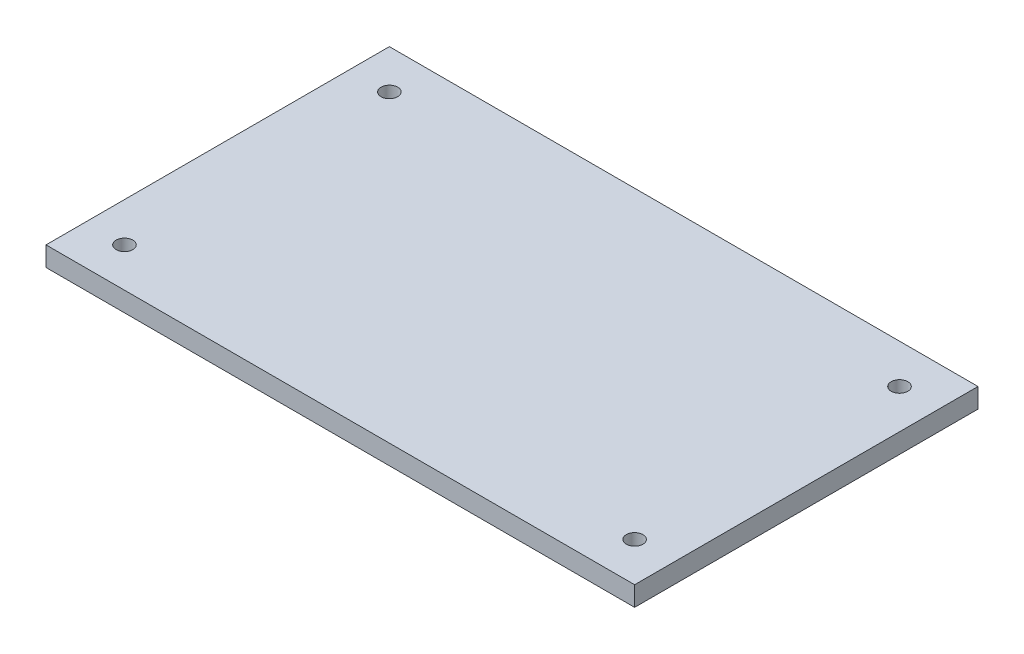
ISO-10303-21;
HEADER;
FILE_DESCRIPTION(('STEP AP214'),'2;1');
FILE_NAME('part.step','',(''),(''),'','','');
FILE_SCHEMA(('AUTOMOTIVE_DESIGN { 1 0 10303 214 1 1 1 1 }'));
ENDSEC;
DATA;
#1=APPLICATION_CONTEXT('core data for automotive mechanical design processes');
#2=APPLICATION_PROTOCOL_DEFINITION('international standard','automotive_design',2000,#1);
#3=PRODUCT_CONTEXT('',#1,'mechanical');
#4=PRODUCT('Part','Part','',(#3));
#5=PRODUCT_RELATED_PRODUCT_CATEGORY('part','',(#4));
#6=PRODUCT_DEFINITION_FORMATION('','',#4);
#7=PRODUCT_DEFINITION_CONTEXT('part definition',#1,'design');
#8=PRODUCT_DEFINITION('design','',#6,#7);
#9=PRODUCT_DEFINITION_SHAPE('','',#8);
#10=(LENGTH_UNIT() NAMED_UNIT(*) SI_UNIT(.MILLI.,.METRE.));
#11=(NAMED_UNIT(*) PLANE_ANGLE_UNIT() SI_UNIT($,.RADIAN.));
#12=(NAMED_UNIT(*) SI_UNIT($,.STERADIAN.) SOLID_ANGLE_UNIT());
#13=UNCERTAINTY_MEASURE_WITH_UNIT(LENGTH_MEASURE(1.E-05),#10,'distance_accuracy_value','');
#14=(GEOMETRIC_REPRESENTATION_CONTEXT(3) GLOBAL_UNCERTAINTY_ASSIGNED_CONTEXT((#13)) GLOBAL_UNIT_ASSIGNED_CONTEXT((#10,
#11,#12)) REPRESENTATION_CONTEXT('',''));
#15=CARTESIAN_POINT('',(0.,0.,0.));
#16=DIRECTION('',(0.,0.,1.));
#17=DIRECTION('',(1.,0.,0.));
#18=AXIS2_PLACEMENT_3D('',#15,#16,#17);
#19=CARTESIAN_POINT('',(0.,4.,0.));
#20=DIRECTION('',(0.,-1.,0.));
#21=DIRECTION('',(0.,0.,-1.));
#22=AXIS2_PLACEMENT_3D('',#19,#20,#21);
#23=PLANE('',#22);
#24=DIRECTION('',(0.,0.,1.));
#25=VECTOR('',#24,1.);
#26=CARTESIAN_POINT('',(0.,4.,0.));
#27=LINE('',#26,#25);
#28=CARTESIAN_POINT('',(0.,4.,-70.));
#29=VERTEX_POINT('',#28);
#30=CARTESIAN_POINT('',(0.,4.,0.));
#31=VERTEX_POINT('',#30);
#32=EDGE_CURVE('E94',#29,#31,#27,.T.);
#33=ORIENTED_EDGE('',*,*,#32,.T.);
#34=DIRECTION('',(1.,0.,0.));
#35=VECTOR('',#34,1.);
#36=CARTESIAN_POINT('',(0.,4.,0.));
#37=LINE('',#36,#35);
#38=CARTESIAN_POINT('',(120.,4.,0.));
#39=VERTEX_POINT('',#38);
#40=EDGE_CURVE('E89',#31,#39,#37,.T.);
#41=ORIENTED_EDGE('',*,*,#40,.T.);
#42=DIRECTION('',(0.,0.,-1.));
#43=VECTOR('',#42,1.);
#44=CARTESIAN_POINT('',(120.,4.,0.));
#45=LINE('',#44,#43);
#46=CARTESIAN_POINT('',(120.,4.,-70.));
#47=VERTEX_POINT('',#46);
#48=EDGE_CURVE('E92',#39,#47,#45,.T.);
#49=ORIENTED_EDGE('',*,*,#48,.T.);
#50=DIRECTION('',(-1.,0.,0.));
#51=VECTOR('',#50,1.);
#52=CARTESIAN_POINT('',(0.,4.,-70.));
#53=LINE('',#52,#51);
#54=EDGE_CURVE('E59',#47,#29,#53,.T.);
#55=ORIENTED_EDGE('',*,*,#54,.T.);
#56=EDGE_LOOP('',(#33,#41,#49,#55));
#57=FACE_BOUND('',#56,.T.);
#58=CARTESIAN_POINT('',(7.99999999999999,4.,-62.));
#59=DIRECTION('',(0.,1.,0.));
#60=DIRECTION('',(0.,0.,1.));
#61=AXIS2_PLACEMENT_3D('',#58,#59,#60);
#62=CIRCLE('',#61,1.7);
#63=CARTESIAN_POINT('',(7.99999999999999,4.,-60.3));
#64=VERTEX_POINT('',#63);
#65=EDGE_CURVE('E109',#64,#64,#62,.T.);
#66=ORIENTED_EDGE('',*,*,#65,.F.);
#67=EDGE_LOOP('',(#66));
#68=FACE_BOUND('',#67,.T.);
#69=CARTESIAN_POINT('',(112.,4.,-62.));
#70=DIRECTION('',(0.,1.,0.));
#71=DIRECTION('',(0.,0.,1.));
#72=AXIS2_PLACEMENT_3D('',#69,#70,#71);
#73=CIRCLE('',#72,1.7);
#74=CARTESIAN_POINT('',(112.,4.,-60.3));
#75=VERTEX_POINT('',#74);
#76=EDGE_CURVE('E124',#75,#75,#73,.T.);
#77=ORIENTED_EDGE('',*,*,#76,.F.);
#78=EDGE_LOOP('',(#77));
#79=FACE_BOUND('',#78,.T.);
#80=CARTESIAN_POINT('',(112.,4.,-7.99999999999999));
#81=DIRECTION('',(0.,1.,0.));
#82=DIRECTION('',(0.,0.,1.));
#83=AXIS2_PLACEMENT_3D('',#80,#81,#82);
#84=CIRCLE('',#83,1.7);
#85=CARTESIAN_POINT('',(112.,4.,-6.29999999999999));
#86=VERTEX_POINT('',#85);
#87=EDGE_CURVE('E130',#86,#86,#84,.T.);
#88=ORIENTED_EDGE('',*,*,#87,.F.);
#89=EDGE_LOOP('',(#88));
#90=FACE_BOUND('',#89,.T.);
#91=CARTESIAN_POINT('',(8.,4.,-7.99999999999999));
#92=DIRECTION('',(0.,1.,0.));
#93=DIRECTION('',(0.,0.,1.));
#94=AXIS2_PLACEMENT_3D('',#91,#92,#93);
#95=CIRCLE('',#94,1.7);
#96=CARTESIAN_POINT('',(8.,4.,-6.29999999999999));
#97=VERTEX_POINT('',#96);
#98=EDGE_CURVE('E136',#97,#97,#95,.T.);
#99=ORIENTED_EDGE('',*,*,#98,.F.);
#100=EDGE_LOOP('',(#99));
#101=FACE_BOUND('',#100,.T.);
#102=ADVANCED_FACE('F42',(#57,#68,#79,#90,#101),#23,.F.);
#103=CARTESIAN_POINT('',(0.,0.,0.));
#104=DIRECTION('',(0.,-1.,0.));
#105=DIRECTION('',(0.,0.,-1.));
#106=AXIS2_PLACEMENT_3D('',#103,#104,#105);
#107=PLANE('',#106);
#108=CARTESIAN_POINT('',(112.,0.,-7.99999999999999));
#109=DIRECTION('',(0.,1.,0.));
#110=DIRECTION('',(0.,0.,1.));
#111=AXIS2_PLACEMENT_3D('',#108,#109,#110);
#112=CIRCLE('',#111,1.7);
#113=CARTESIAN_POINT('',(112.,0.,-6.29999999999999));
#114=VERTEX_POINT('',#113);
#115=EDGE_CURVE('E133',#114,#114,#112,.T.);
#116=ORIENTED_EDGE('',*,*,#115,.T.);
#117=EDGE_LOOP('',(#116));
#118=FACE_BOUND('',#117,.T.);
#119=CARTESIAN_POINT('',(7.99999999999999,0.,-62.));
#120=DIRECTION('',(0.,1.,0.));
#121=DIRECTION('',(0.,0.,1.));
#122=AXIS2_PLACEMENT_3D('',#119,#120,#121);
#123=CIRCLE('',#122,1.7);
#124=CARTESIAN_POINT('',(7.99999999999999,0.,-60.3));
#125=VERTEX_POINT('',#124);
#126=EDGE_CURVE('E121',#125,#125,#123,.T.);
#127=ORIENTED_EDGE('',*,*,#126,.T.);
#128=EDGE_LOOP('',(#127));
#129=FACE_BOUND('',#128,.T.);
#130=DIRECTION('',(0.,0.,1.));
#131=VECTOR('',#130,1.);
#132=CARTESIAN_POINT('',(0.,0.,0.));
#133=LINE('',#132,#131);
#134=CARTESIAN_POINT('',(0.,0.,-70.));
#135=VERTEX_POINT('',#134);
#136=CARTESIAN_POINT('',(0.,0.,0.));
#137=VERTEX_POINT('',#136);
#138=EDGE_CURVE('E106',#135,#137,#133,.T.);
#139=ORIENTED_EDGE('',*,*,#138,.F.);
#140=DIRECTION('',(-1.,0.,0.));
#141=VECTOR('',#140,1.);
#142=CARTESIAN_POINT('',(0.,0.,-70.));
#143=LINE('',#142,#141);
#144=CARTESIAN_POINT('',(120.,0.,-70.));
#145=VERTEX_POINT('',#144);
#146=EDGE_CURVE('E82',#145,#135,#143,.T.);
#147=ORIENTED_EDGE('',*,*,#146,.F.);
#148=DIRECTION('',(0.,0.,-1.));
#149=VECTOR('',#148,1.);
#150=CARTESIAN_POINT('',(120.,0.,0.));
#151=LINE('',#150,#149);
#152=CARTESIAN_POINT('',(120.,0.,0.));
#153=VERTEX_POINT('',#152);
#154=EDGE_CURVE('E76',#153,#145,#151,.T.);
#155=ORIENTED_EDGE('',*,*,#154,.F.);
#156=DIRECTION('',(1.,0.,0.));
#157=VECTOR('',#156,1.);
#158=CARTESIAN_POINT('',(0.,0.,0.));
#159=LINE('',#158,#157);
#160=EDGE_CURVE('E98',#137,#153,#159,.T.);
#161=ORIENTED_EDGE('',*,*,#160,.F.);
#162=EDGE_LOOP('',(#139,#147,#155,#161));
#163=FACE_BOUND('',#162,.T.);
#164=CARTESIAN_POINT('',(112.,0.,-62.));
#165=DIRECTION('',(0.,1.,0.));
#166=DIRECTION('',(0.,0.,1.));
#167=AXIS2_PLACEMENT_3D('',#164,#165,#166);
#168=CIRCLE('',#167,1.7);
#169=CARTESIAN_POINT('',(112.,0.,-60.3));
#170=VERTEX_POINT('',#169);
#171=EDGE_CURVE('E127',#170,#170,#168,.T.);
#172=ORIENTED_EDGE('',*,*,#171,.T.);
#173=EDGE_LOOP('',(#172));
#174=FACE_BOUND('',#173,.T.);
#175=CARTESIAN_POINT('',(8.,0.,-7.99999999999999));
#176=DIRECTION('',(0.,1.,0.));
#177=DIRECTION('',(0.,0.,1.));
#178=AXIS2_PLACEMENT_3D('',#175,#176,#177);
#179=CIRCLE('',#178,1.7);
#180=CARTESIAN_POINT('',(8.,0.,-6.29999999999999));
#181=VERTEX_POINT('',#180);
#182=EDGE_CURVE('E139',#181,#181,#179,.T.);
#183=ORIENTED_EDGE('',*,*,#182,.T.);
#184=EDGE_LOOP('',(#183));
#185=FACE_BOUND('',#184,.T.);
#186=ADVANCED_FACE('F117',(#118,#129,#163,#174,#185),#107,.T.);
#187=CARTESIAN_POINT('',(0.,4.,0.));
#188=DIRECTION('',(1.,0.,0.));
#189=DIRECTION('',(0.,0.,-1.));
#190=AXIS2_PLACEMENT_3D('',#187,#188,#189);
#191=PLANE('',#190);
#192=ORIENTED_EDGE('',*,*,#138,.T.);
#193=DIRECTION('',(0.,-1.,0.));
#194=VECTOR('',#193,1.);
#195=CARTESIAN_POINT('',(0.,4.,0.));
#196=LINE('',#195,#194);
#197=EDGE_CURVE('E11',#31,#137,#196,.T.);
#198=ORIENTED_EDGE('',*,*,#197,.F.);
#199=ORIENTED_EDGE('',*,*,#32,.F.);
#200=DIRECTION('',(0.,-1.,0.));
#201=VECTOR('',#200,1.);
#202=CARTESIAN_POINT('',(0.,4.,-70.));
#203=LINE('',#202,#201);
#204=EDGE_CURVE('E102',#29,#135,#203,.T.);
#205=ORIENTED_EDGE('',*,*,#204,.T.);
#206=EDGE_LOOP('',(#192,#198,#199,#205));
#207=FACE_BOUND('',#206,.T.);
#208=ADVANCED_FACE('F44',(#207),#191,.F.);
#209=CARTESIAN_POINT('',(0.,4.,0.));
#210=DIRECTION('',(0.,0.,-1.));
#211=DIRECTION('',(-1.,0.,0.));
#212=AXIS2_PLACEMENT_3D('',#209,#210,#211);
#213=PLANE('',#212);
#214=ORIENTED_EDGE('',*,*,#160,.T.);
#215=DIRECTION('',(0.,-1.,0.));
#216=VECTOR('',#215,1.);
#217=CARTESIAN_POINT('',(120.,4.,0.));
#218=LINE('',#217,#216);
#219=EDGE_CURVE('E51',#39,#153,#218,.T.);
#220=ORIENTED_EDGE('',*,*,#219,.F.);
#221=ORIENTED_EDGE('',*,*,#40,.F.);
#222=ORIENTED_EDGE('',*,*,#197,.T.);
#223=EDGE_LOOP('',(#214,#220,#221,#222));
#224=FACE_BOUND('',#223,.T.);
#225=ADVANCED_FACE('F97',(#224),#213,.F.);
#226=CARTESIAN_POINT('',(120.,4.,0.));
#227=DIRECTION('',(-1.,0.,0.));
#228=DIRECTION('',(0.,0.,1.));
#229=AXIS2_PLACEMENT_3D('',#226,#227,#228);
#230=PLANE('',#229);
#231=ORIENTED_EDGE('',*,*,#154,.T.);
#232=DIRECTION('',(0.,-1.,0.));
#233=VECTOR('',#232,1.);
#234=CARTESIAN_POINT('',(120.,4.,-70.));
#235=LINE('',#234,#233);
#236=EDGE_CURVE('E99',#47,#145,#235,.T.);
#237=ORIENTED_EDGE('',*,*,#236,.F.);
#238=ORIENTED_EDGE('',*,*,#48,.F.);
#239=ORIENTED_EDGE('',*,*,#219,.T.);
#240=EDGE_LOOP('',(#231,#237,#238,#239));
#241=FACE_BOUND('',#240,.T.);
#242=ADVANCED_FACE('F100',(#241),#230,.F.);
#243=CARTESIAN_POINT('',(0.,4.,-70.));
#244=DIRECTION('',(0.,0.,1.));
#245=DIRECTION('',(1.,0.,0.));
#246=AXIS2_PLACEMENT_3D('',#243,#244,#245);
#247=PLANE('',#246);
#248=ORIENTED_EDGE('',*,*,#146,.T.);
#249=ORIENTED_EDGE('',*,*,#204,.F.);
#250=ORIENTED_EDGE('',*,*,#54,.F.);
#251=ORIENTED_EDGE('',*,*,#236,.T.);
#252=EDGE_LOOP('',(#248,#249,#250,#251));
#253=FACE_BOUND('',#252,.T.);
#254=ADVANCED_FACE('F114',(#253),#247,.F.);
#255=CARTESIAN_POINT('',(7.99999999999999,4.,-62.));
#256=DIRECTION('',(0.,-1.,0.));
#257=DIRECTION('',(0.,0.,-1.));
#258=AXIS2_PLACEMENT_3D('',#255,#256,#257);
#259=CYLINDRICAL_SURFACE('',#258,1.7);
#260=ORIENTED_EDGE('',*,*,#65,.T.);
#261=EDGE_LOOP('',(#260));
#262=FACE_BOUND('',#261,.T.);
#263=ORIENTED_EDGE('',*,*,#126,.F.);
#264=EDGE_LOOP('',(#263));
#265=FACE_BOUND('',#264,.T.);
#266=ADVANCED_FACE('F156',(#262,#265),#259,.F.);
#267=CARTESIAN_POINT('',(112.,4.,-62.));
#268=DIRECTION('',(0.,-1.,0.));
#269=DIRECTION('',(0.,0.,-1.));
#270=AXIS2_PLACEMENT_3D('',#267,#268,#269);
#271=CYLINDRICAL_SURFACE('',#270,1.7);
#272=ORIENTED_EDGE('',*,*,#76,.T.);
#273=EDGE_LOOP('',(#272));
#274=FACE_BOUND('',#273,.T.);
#275=ORIENTED_EDGE('',*,*,#171,.F.);
#276=EDGE_LOOP('',(#275));
#277=FACE_BOUND('',#276,.T.);
#278=ADVANCED_FACE('F201',(#274,#277),#271,.F.);
#279=CARTESIAN_POINT('',(112.,4.,-7.99999999999999));
#280=DIRECTION('',(0.,-1.,0.));
#281=DIRECTION('',(0.,0.,-1.));
#282=AXIS2_PLACEMENT_3D('',#279,#280,#281);
#283=CYLINDRICAL_SURFACE('',#282,1.7);
#284=ORIENTED_EDGE('',*,*,#87,.T.);
#285=EDGE_LOOP('',(#284));
#286=FACE_BOUND('',#285,.T.);
#287=ORIENTED_EDGE('',*,*,#115,.F.);
#288=EDGE_LOOP('',(#287));
#289=FACE_BOUND('',#288,.T.);
#290=ADVANCED_FACE('F209',(#286,#289),#283,.F.);
#291=CARTESIAN_POINT('',(8.,4.,-7.99999999999999));
#292=DIRECTION('',(0.,-1.,0.));
#293=DIRECTION('',(0.,0.,-1.));
#294=AXIS2_PLACEMENT_3D('',#291,#292,#293);
#295=CYLINDRICAL_SURFACE('',#294,1.7);
#296=ORIENTED_EDGE('',*,*,#98,.T.);
#297=EDGE_LOOP('',(#296));
#298=FACE_BOUND('',#297,.T.);
#299=ORIENTED_EDGE('',*,*,#182,.F.);
#300=EDGE_LOOP('',(#299));
#301=FACE_BOUND('',#300,.T.);
#302=ADVANCED_FACE('F145',(#298,#301),#295,.F.);
#303=CLOSED_SHELL('',(#102,#186,#208,#225,#242,#254,#266,#278,#290,#302));
#304=MANIFOLD_SOLID_BREP('B2',#303);
#305=ADVANCED_BREP_SHAPE_REPRESENTATION('',(#18,#304),#14);
#306=SHAPE_DEFINITION_REPRESENTATION(#9,#305);
ENDSEC;
END-ISO-10303-21;
